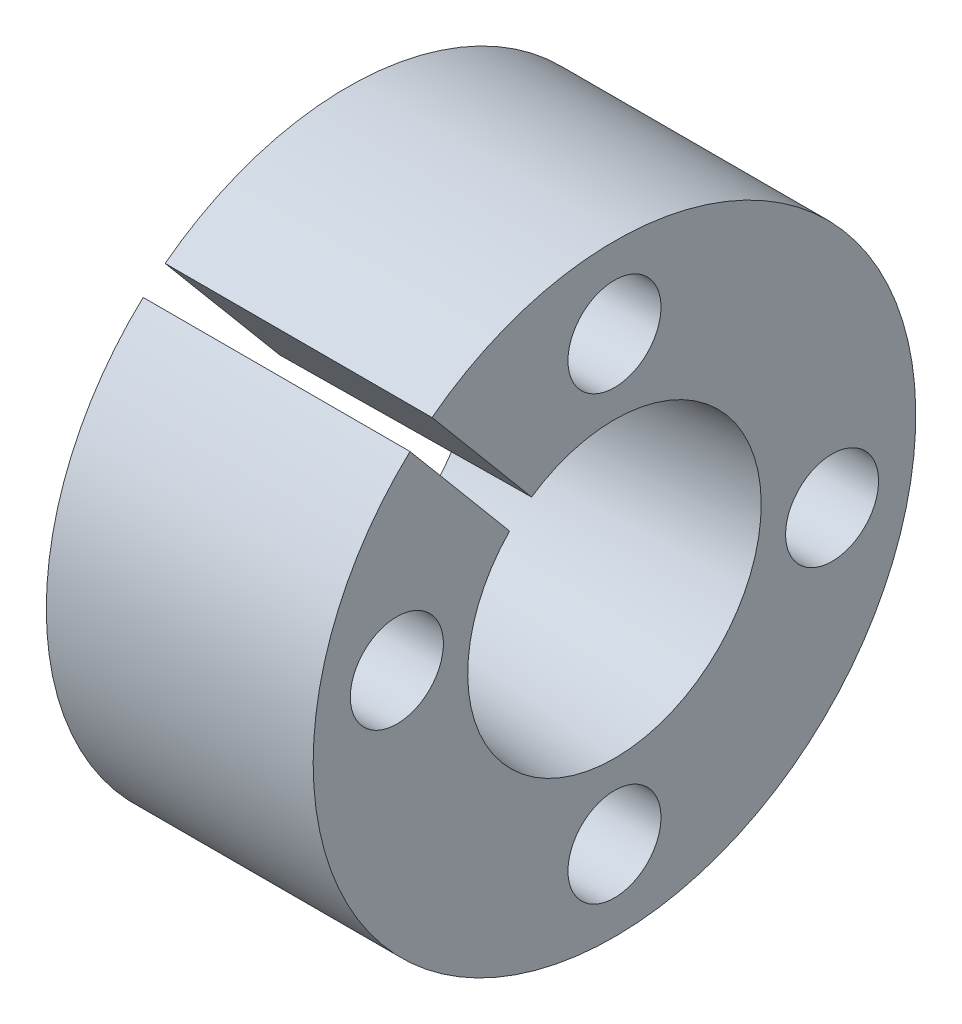
ISO-10303-21;
HEADER;
FILE_DESCRIPTION(('STEP AP214'),'2;1');
FILE_NAME('part.step','',(''),(''),'','','');
FILE_SCHEMA(('AUTOMOTIVE_DESIGN { 1 0 10303 214 1 1 1 1 }'));
ENDSEC;
DATA;
#1=APPLICATION_CONTEXT('core data for automotive mechanical design processes');
#2=APPLICATION_PROTOCOL_DEFINITION('international standard','automotive_design',2000,#1);
#3=PRODUCT_CONTEXT('',#1,'mechanical');
#4=PRODUCT('Part','Part','',(#3));
#5=PRODUCT_RELATED_PRODUCT_CATEGORY('part','',(#4));
#6=PRODUCT_DEFINITION_FORMATION('','',#4);
#7=PRODUCT_DEFINITION_CONTEXT('part definition',#1,'design');
#8=PRODUCT_DEFINITION('design','',#6,#7);
#9=PRODUCT_DEFINITION_SHAPE('','',#8);
#10=(LENGTH_UNIT() NAMED_UNIT(*) SI_UNIT(.MILLI.,.METRE.));
#11=(NAMED_UNIT(*) PLANE_ANGLE_UNIT() SI_UNIT($,.RADIAN.));
#12=(NAMED_UNIT(*) SI_UNIT($,.STERADIAN.) SOLID_ANGLE_UNIT());
#13=UNCERTAINTY_MEASURE_WITH_UNIT(LENGTH_MEASURE(1.E-05),#10,'distance_accuracy_value','');
#14=(GEOMETRIC_REPRESENTATION_CONTEXT(3) GLOBAL_UNCERTAINTY_ASSIGNED_CONTEXT((#13)) GLOBAL_UNIT_ASSIGNED_CONTEXT((#10,
#11,#12)) REPRESENTATION_CONTEXT('',''));
#15=CARTESIAN_POINT('',(0.,0.,0.));
#16=DIRECTION('',(0.,0.,1.));
#17=DIRECTION('',(1.,0.,0.));
#18=AXIS2_PLACEMENT_3D('',#15,#16,#17);
#19=CARTESIAN_POINT('',(0.,1.33709096803531,7.58301969819401));
#20=DIRECTION('',(-1.,0.,0.));
#21=DIRECTION('',(0.,0.,1.));
#22=AXIS2_PLACEMENT_3D('',#19,#20,#21);
#23=CYLINDRICAL_SURFACE('',#22,1.621);
#24=CARTESIAN_POINT('',(9.3,1.33709096803531,7.58301969819401));
#25=DIRECTION('',(-1.,0.,0.));
#26=DIRECTION('',(0.,0.,1.));
#27=AXIS2_PLACEMENT_3D('',#24,#25,#26);
#28=CIRCLE('',#27,1.621);
#29=CARTESIAN_POINT('',(9.3,1.33709096803531,9.20401969819401));
#30=VERTEX_POINT('',#29);
#31=EDGE_CURVE('E106',#30,#30,#28,.T.);
#32=ORIENTED_EDGE('',*,*,#31,.F.);
#33=EDGE_LOOP('',(#32));
#34=FACE_BOUND('',#33,.T.);
#35=CARTESIAN_POINT('',(0.,1.33709096803531,7.58301969819401));
#36=DIRECTION('',(-1.,0.,0.));
#37=DIRECTION('',(0.,0.,1.));
#38=AXIS2_PLACEMENT_3D('',#35,#36,#37);
#39=CIRCLE('',#38,1.621);
#40=CARTESIAN_POINT('',(0.,1.33709096803531,9.20401969819401));
#41=VERTEX_POINT('',#40);
#42=EDGE_CURVE('E130',#41,#41,#39,.T.);
#43=ORIENTED_EDGE('',*,*,#42,.T.);
#44=EDGE_LOOP('',(#43));
#45=FACE_BOUND('',#44,.T.);
#46=ADVANCED_FACE('F16',(#34,#45),#23,.F.);
#47=CARTESIAN_POINT('',(0.,-1.33709096803531,-7.58301969819401));
#48=DIRECTION('',(-1.,0.,0.));
#49=DIRECTION('',(0.,0.,1.));
#50=AXIS2_PLACEMENT_3D('',#47,#48,#49);
#51=CYLINDRICAL_SURFACE('',#50,1.621);
#52=CARTESIAN_POINT('',(9.3,-1.33709096803531,-7.58301969819401));
#53=DIRECTION('',(-1.,0.,0.));
#54=DIRECTION('',(0.,0.,1.));
#55=AXIS2_PLACEMENT_3D('',#52,#53,#54);
#56=CIRCLE('',#55,1.621);
#57=CARTESIAN_POINT('',(9.3,-1.33709096803531,-5.96201969819401));
#58=VERTEX_POINT('',#57);
#59=EDGE_CURVE('E110',#58,#58,#56,.T.);
#60=ORIENTED_EDGE('',*,*,#59,.F.);
#61=EDGE_LOOP('',(#60));
#62=FACE_BOUND('',#61,.T.);
#63=CARTESIAN_POINT('',(0.,-1.33709096803531,-7.58301969819401));
#64=DIRECTION('',(-1.,0.,0.));
#65=DIRECTION('',(0.,0.,1.));
#66=AXIS2_PLACEMENT_3D('',#63,#64,#65);
#67=CIRCLE('',#66,1.621);
#68=CARTESIAN_POINT('',(0.,-1.33709096803531,-5.96201969819401));
#69=VERTEX_POINT('',#68);
#70=EDGE_CURVE('E129',#69,#69,#67,.T.);
#71=ORIENTED_EDGE('',*,*,#70,.T.);
#72=EDGE_LOOP('',(#71));
#73=FACE_BOUND('',#72,.T.);
#74=ADVANCED_FACE('F184',(#62,#73),#51,.F.);
#75=CARTESIAN_POINT('',(9.301,0.321393804843268,-0.38302222155949));
#76=DIRECTION('',(0.,0.642787609686534,-0.766044443118982));
#77=DIRECTION('',(-1.,0.,0.));
#78=AXIS2_PLACEMENT_3D('',#75,#76,#77);
#79=PLANE('',#78);
#80=DIRECTION('',(-1.,0.,0.));
#81=VECTOR('',#80,1.);
#82=CARTESIAN_POINT('',(0.,8.35573570519091,6.3585911037743));
#83=LINE('',#82,#81);
#84=CARTESIAN_POINT('',(9.3,8.35573570519092,6.3585911037743));
#85=VERTEX_POINT('',#84);
#86=CARTESIAN_POINT('',(0.,8.35573570519092,6.3585911037743));
#87=VERTEX_POINT('',#86);
#88=EDGE_CURVE('E82',#85,#87,#83,.T.);
#89=ORIENTED_EDGE('',*,*,#88,.T.);
#90=DIRECTION('',(0.,-0.766044443118982,-0.642787609686534));
#91=VECTOR('',#90,1.);
#92=CARTESIAN_POINT('',(0.,0.321393804843268,-0.38302222155949));
#93=LINE('',#92,#91);
#94=CARTESIAN_POINT('',(0.,3.59304039032932,2.36221522166423));
#95=VERTEX_POINT('',#94);
#96=EDGE_CURVE('E79',#87,#95,#93,.T.);
#97=ORIENTED_EDGE('',*,*,#96,.T.);
#98=CARTESIAN_POINT('',(0.,3.59304039032932,2.36221522166423));
#99=CARTESIAN_POINT('',(2.62660195301839,3.7702780677644,2.51093529143072));
#100=CARTESIAN_POINT('',(5.25322569490347,3.94732629380376,2.65949639260094));
#101=CARTESIAN_POINT('',(7.87986317669142,4.12425472224176,2.80795697164803));
#102=CARTESIAN_POINT('',(8.35324167032161,4.15614116013624,2.83471286992485));
#103=CARTESIAN_POINT('',(8.82662062245485,4.18802360383703,2.86146541667521));
#104=CARTESIAN_POINT('',(9.3,4.21990234025849,2.88821485264886));
#105=B_SPLINE_CURVE_WITH_KNOTS('',3,(#98,#99,#100,#101,#102,#103,#104),.UNSPECIFIED.,.F.,.F.,(4,
3,4),(2.00774417717673E-07,0.0079105179651178,0.00933613305383524),.UNSPECIFIED.);
#106=CARTESIAN_POINT('',(9.3,4.21990234025849,2.88821485264886));
#107=VERTEX_POINT('',#106);
#108=EDGE_CURVE('E19',#95,#107,#105,.T.);
#109=ORIENTED_EDGE('',*,*,#108,.T.);
#110=DIRECTION('',(0.,0.766044443118982,0.642787609686534));
#111=VECTOR('',#110,1.);
#112=CARTESIAN_POINT('',(9.3,0.321393804843268,-0.38302222155949));
#113=LINE('',#112,#111);
#114=EDGE_CURVE('E112',#107,#85,#113,.T.);
#115=ORIENTED_EDGE('',*,*,#114,.T.);
#116=EDGE_LOOP('',(#89,#97,#109,#115));
#117=FACE_BOUND('',#116,.T.);
#118=ADVANCED_FACE('F80',(#117),#79,.F.);
#119=CARTESIAN_POINT('',(9.301,-0.321393804843268,0.38302222155949));
#120=DIRECTION('',(0.,-0.642787609686537,0.76604444311898));
#121=DIRECTION('',(-1.,0.,0.));
#122=AXIS2_PLACEMENT_3D('',#119,#120,#121);
#123=PLANE('',#122);
#124=DIRECTION('',(1.,0.,0.));
#125=VECTOR('',#124,1.);
#126=CARTESIAN_POINT('',(0.,7.71294809550435,7.12463554689331));
#127=LINE('',#126,#125);
#128=CARTESIAN_POINT('',(0.,7.71294809550436,7.12463554689331));
#129=VERTEX_POINT('',#128);
#130=CARTESIAN_POINT('',(9.3,7.71294809550436,7.12463554689331));
#131=VERTEX_POINT('',#130);
#132=EDGE_CURVE('E103',#129,#131,#127,.T.);
#133=ORIENTED_EDGE('',*,*,#132,.T.);
#134=DIRECTION('',(0.,-0.76604444311898,-0.642787609686537));
#135=VECTOR('',#134,1.);
#136=CARTESIAN_POINT('',(9.3,-0.321393804843268,0.38302222155949));
#137=LINE('',#136,#135);
#138=CARTESIAN_POINT('',(9.3,3.57711473057194,3.65425929576786));
#139=VERTEX_POINT('',#138);
#140=EDGE_CURVE('E111',#131,#139,#137,.T.);
#141=ORIENTED_EDGE('',*,*,#140,.T.);
#142=CARTESIAN_POINT('',(9.3,3.57711473057194,3.65425929576786));
#143=CARTESIAN_POINT('',(6.19997823742652,3.36835029900256,3.47908513823505));
#144=CARTESIAN_POINT('',(3.09997404223129,3.15943262942905,3.3037823987495));
#145=CARTESIAN_POINT('',(0.,2.95025278064277,3.12825966478322));
#146=B_SPLINE_CURVE_WITH_KNOTS('',3,(#142,#143,#144,#145),.UNSPECIFIED.,.F.,.F.,(4,4),
(2.00771327063739E-07,0.00933613305021946),.UNSPECIFIED.);
#147=CARTESIAN_POINT('',(0.,2.95025278064277,3.12825966478322));
#148=VERTEX_POINT('',#147);
#149=EDGE_CURVE('E11',#139,#148,#146,.T.);
#150=ORIENTED_EDGE('',*,*,#149,.T.);
#151=DIRECTION('',(0.,0.76604444311898,0.642787609686537));
#152=VECTOR('',#151,1.);
#153=CARTESIAN_POINT('',(0.,-0.321393804843268,0.38302222155949));
#154=LINE('',#153,#152);
#155=EDGE_CURVE('E92',#148,#129,#154,.T.);
#156=ORIENTED_EDGE('',*,*,#155,.T.);
#157=EDGE_LOOP('',(#133,#141,#150,#156));
#158=FACE_BOUND('',#157,.T.);
#159=ADVANCED_FACE('F198',(#158),#123,.F.);
#160=CARTESIAN_POINT('',(0.,7.7,0.));
#161=DIRECTION('',(-1.,0.,0.));
#162=DIRECTION('',(0.,0.,1.));
#163=AXIS2_PLACEMENT_3D('',#160,#161,#162);
#164=CYLINDRICAL_SURFACE('',#163,1.621);
#165=CARTESIAN_POINT('',(9.3,7.7,0.));
#166=DIRECTION('',(-1.,0.,0.));
#167=DIRECTION('',(0.,0.,1.));
#168=AXIS2_PLACEMENT_3D('',#165,#166,#167);
#169=CIRCLE('',#168,1.621);
#170=CARTESIAN_POINT('',(9.3,7.7,1.62100000000003));
#171=VERTEX_POINT('',#170);
#172=EDGE_CURVE('E125',#171,#171,#169,.T.);
#173=ORIENTED_EDGE('',*,*,#172,.F.);
#174=EDGE_LOOP('',(#173));
#175=FACE_BOUND('',#174,.T.);
#176=CARTESIAN_POINT('',(0.,7.7,0.));
#177=DIRECTION('',(-1.,0.,0.));
#178=DIRECTION('',(0.,0.,1.));
#179=AXIS2_PLACEMENT_3D('',#176,#177,#178);
#180=CIRCLE('',#179,1.621);
#181=CARTESIAN_POINT('',(0.,7.7,1.62100000000003));
#182=VERTEX_POINT('',#181);
#183=EDGE_CURVE('E121',#182,#182,#180,.T.);
#184=ORIENTED_EDGE('',*,*,#183,.T.);
#185=EDGE_LOOP('',(#184));
#186=FACE_BOUND('',#185,.T.);
#187=ADVANCED_FACE('F166',(#175,#186),#164,.F.);
#188=CARTESIAN_POINT('',(0.,-7.7,0.));
#189=DIRECTION('',(-1.,0.,0.));
#190=DIRECTION('',(0.,0.,1.));
#191=AXIS2_PLACEMENT_3D('',#188,#189,#190);
#192=CYLINDRICAL_SURFACE('',#191,1.621);
#193=CARTESIAN_POINT('',(9.3,-7.7,0.));
#194=DIRECTION('',(-1.,0.,0.));
#195=DIRECTION('',(0.,0.,1.));
#196=AXIS2_PLACEMENT_3D('',#193,#194,#195);
#197=CIRCLE('',#196,1.621);
#198=CARTESIAN_POINT('',(9.3,-7.7,1.62099999999997));
#199=VERTEX_POINT('',#198);
#200=EDGE_CURVE('E77',#199,#199,#197,.T.);
#201=ORIENTED_EDGE('',*,*,#200,.F.);
#202=EDGE_LOOP('',(#201));
#203=FACE_BOUND('',#202,.T.);
#204=CARTESIAN_POINT('',(0.,-7.7,0.));
#205=DIRECTION('',(-1.,0.,0.));
#206=DIRECTION('',(0.,0.,1.));
#207=AXIS2_PLACEMENT_3D('',#204,#205,#206);
#208=CIRCLE('',#207,1.621);
#209=CARTESIAN_POINT('',(0.,-7.7,1.62099999999997));
#210=VERTEX_POINT('',#209);
#211=EDGE_CURVE('E117',#210,#210,#208,.T.);
#212=ORIENTED_EDGE('',*,*,#211,.T.);
#213=EDGE_LOOP('',(#212));
#214=FACE_BOUND('',#213,.T.);
#215=ADVANCED_FACE('F163',(#203,#214),#192,.F.);
#216=CARTESIAN_POINT('',(0.,0.,0.));
#217=DIRECTION('',(1.,0.,0.));
#218=DIRECTION('',(0.,0.,-1.));
#219=AXIS2_PLACEMENT_3D('',#216,#217,#218);
#220=CONICAL_SURFACE('',#219,4.3,0.08726646259971);
#221=CARTESIAN_POINT('',(9.3,0.,0.));
#222=DIRECTION('',(-1.,0.,0.));
#223=DIRECTION('',(0.,0.,1.));
#224=AXIS2_PLACEMENT_3D('',#221,#222,#223);
#225=CIRCLE('',#224,5.11364457079103);
#226=EDGE_CURVE('E74',#107,#139,#225,.T.);
#227=ORIENTED_EDGE('',*,*,#226,.F.);
#228=ORIENTED_EDGE('',*,*,#108,.F.);
#229=CARTESIAN_POINT('',(0.,0.,0.));
#230=DIRECTION('',(-1.,0.,0.));
#231=DIRECTION('',(0.,0.,1.));
#232=AXIS2_PLACEMENT_3D('',#229,#230,#231);
#233=CIRCLE('',#232,4.3);
#234=EDGE_CURVE('E72',#95,#148,#233,.T.);
#235=ORIENTED_EDGE('',*,*,#234,.T.);
#236=ORIENTED_EDGE('',*,*,#149,.F.);
#237=EDGE_LOOP('',(#227,#228,#235,#236));
#238=FACE_BOUND('',#237,.T.);
#239=ADVANCED_FACE('F70',(#238),#220,.F.);
#240=CARTESIAN_POINT('',(9.3,10.5,0.));
#241=DIRECTION('',(-1.,0.,0.));
#242=DIRECTION('',(0.,0.,1.));
#243=AXIS2_PLACEMENT_3D('',#240,#241,#242);
#244=PLANE('',#243);
#245=ORIENTED_EDGE('',*,*,#200,.T.);
#246=EDGE_LOOP('',(#245));
#247=FACE_BOUND('',#246,.T.);
#248=ORIENTED_EDGE('',*,*,#172,.T.);
#249=EDGE_LOOP('',(#248));
#250=FACE_BOUND('',#249,.T.);
#251=ORIENTED_EDGE('',*,*,#59,.T.);
#252=EDGE_LOOP('',(#251));
#253=FACE_BOUND('',#252,.T.);
#254=ORIENTED_EDGE('',*,*,#31,.T.);
#255=EDGE_LOOP('',(#254));
#256=FACE_BOUND('',#255,.T.);
#257=CARTESIAN_POINT('',(9.3,0.,0.));
#258=DIRECTION('',(-1.,0.,0.));
#259=DIRECTION('',(0.,0.,1.));
#260=AXIS2_PLACEMENT_3D('',#257,#258,#259);
#261=CIRCLE('',#260,10.5);
#262=EDGE_CURVE('E99',#85,#131,#261,.T.);
#263=ORIENTED_EDGE('',*,*,#262,.F.);
#264=ORIENTED_EDGE('',*,*,#114,.F.);
#265=ORIENTED_EDGE('',*,*,#226,.T.);
#266=ORIENTED_EDGE('',*,*,#140,.F.);
#267=EDGE_LOOP('',(#263,#264,#265,#266));
#268=FACE_BOUND('',#267,.T.);
#269=ADVANCED_FACE('F160',(#247,#250,#253,#256,#268),#244,.F.);
#270=CARTESIAN_POINT('',(0.,0.,0.));
#271=DIRECTION('',(-1.,0.,0.));
#272=DIRECTION('',(0.,0.,1.));
#273=AXIS2_PLACEMENT_3D('',#270,#271,#272);
#274=CYLINDRICAL_SURFACE('',#273,10.5);
#275=CARTESIAN_POINT('',(0.,0.,0.));
#276=DIRECTION('',(-1.,0.,0.));
#277=DIRECTION('',(0.,0.,1.));
#278=AXIS2_PLACEMENT_3D('',#275,#276,#277);
#279=CIRCLE('',#278,10.5);
#280=EDGE_CURVE('E87',#87,#129,#279,.T.);
#281=ORIENTED_EDGE('',*,*,#280,.F.);
#282=ORIENTED_EDGE('',*,*,#88,.F.);
#283=ORIENTED_EDGE('',*,*,#262,.T.);
#284=ORIENTED_EDGE('',*,*,#132,.F.);
#285=EDGE_LOOP('',(#281,#282,#283,#284));
#286=FACE_BOUND('',#285,.T.);
#287=ADVANCED_FACE('F171',(#286),#274,.T.);
#288=CARTESIAN_POINT('',(0.,4.3,0.));
#289=DIRECTION('',(1.,0.,0.));
#290=DIRECTION('',(0.,1.,0.));
#291=AXIS2_PLACEMENT_3D('',#288,#289,#290);
#292=PLANE('',#291);
#293=ORIENTED_EDGE('',*,*,#42,.F.);
#294=EDGE_LOOP('',(#293));
#295=FACE_BOUND('',#294,.T.);
#296=ORIENTED_EDGE('',*,*,#70,.F.);
#297=EDGE_LOOP('',(#296));
#298=FACE_BOUND('',#297,.T.);
#299=ORIENTED_EDGE('',*,*,#183,.F.);
#300=EDGE_LOOP('',(#299));
#301=FACE_BOUND('',#300,.T.);
#302=ORIENTED_EDGE('',*,*,#211,.F.);
#303=EDGE_LOOP('',(#302));
#304=FACE_BOUND('',#303,.T.);
#305=ORIENTED_EDGE('',*,*,#234,.F.);
#306=ORIENTED_EDGE('',*,*,#96,.F.);
#307=ORIENTED_EDGE('',*,*,#280,.T.);
#308=ORIENTED_EDGE('',*,*,#155,.F.);
#309=EDGE_LOOP('',(#305,#306,#307,#308));
#310=FACE_BOUND('',#309,.T.);
#311=ADVANCED_FACE('F90',(#295,#298,#301,#304,#310),#292,.F.);
#312=CLOSED_SHELL('',(#46,#74,#118,#159,#187,#215,#239,#269,#287,#311));
#313=MANIFOLD_SOLID_BREP('B1',#312);
#314=ADVANCED_BREP_SHAPE_REPRESENTATION('',(#18,#313),#14);
#315=SHAPE_DEFINITION_REPRESENTATION(#9,#314);
ENDSEC;
END-ISO-10303-21;
